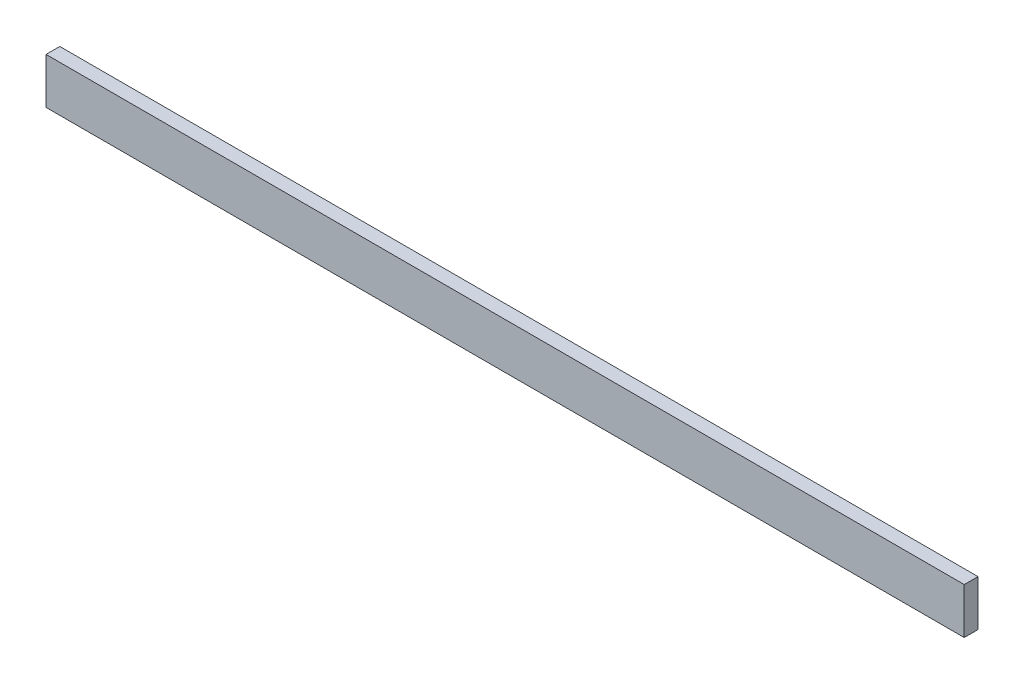
ISO-10303-21;
HEADER;
FILE_DESCRIPTION(('STEP AP214'),'2;1');
FILE_NAME('part.step','',(''),(''),'','','');
FILE_SCHEMA(('AUTOMOTIVE_DESIGN { 1 0 10303 214 1 1 1 1 }'));
ENDSEC;
DATA;
#1=APPLICATION_CONTEXT('core data for automotive mechanical design processes');
#2=APPLICATION_PROTOCOL_DEFINITION('international standard','automotive_design',2000,#1);
#3=PRODUCT_CONTEXT('',#1,'mechanical');
#4=PRODUCT('Part','Part','',(#3));
#5=PRODUCT_RELATED_PRODUCT_CATEGORY('part','',(#4));
#6=PRODUCT_DEFINITION_FORMATION('','',#4);
#7=PRODUCT_DEFINITION_CONTEXT('part definition',#1,'design');
#8=PRODUCT_DEFINITION('design','',#6,#7);
#9=PRODUCT_DEFINITION_SHAPE('','',#8);
#10=(LENGTH_UNIT() NAMED_UNIT(*) SI_UNIT(.MILLI.,.METRE.));
#11=(NAMED_UNIT(*) PLANE_ANGLE_UNIT() SI_UNIT($,.RADIAN.));
#12=(NAMED_UNIT(*) SI_UNIT($,.STERADIAN.) SOLID_ANGLE_UNIT());
#13=UNCERTAINTY_MEASURE_WITH_UNIT(LENGTH_MEASURE(1.E-05),#10,'distance_accuracy_value','');
#14=(GEOMETRIC_REPRESENTATION_CONTEXT(3) GLOBAL_UNCERTAINTY_ASSIGNED_CONTEXT((#13)) GLOBAL_UNIT_ASSIGNED_CONTEXT((#10,
#11,#12)) REPRESENTATION_CONTEXT('',''));
#15=CARTESIAN_POINT('',(0.,0.,0.));
#16=DIRECTION('',(0.,0.,1.));
#17=DIRECTION('',(1.,0.,0.));
#18=AXIS2_PLACEMENT_3D('',#15,#16,#17);
#19=CARTESIAN_POINT('',(0.,0.,3.));
#20=DIRECTION('',(1.,0.,0.));
#21=DIRECTION('',(0.,0.,-1.));
#22=AXIS2_PLACEMENT_3D('',#19,#20,#21);
#23=PLANE('',#22);
#24=DIRECTION('',(0.,-1.,0.));
#25=VECTOR('',#24,1.);
#26=CARTESIAN_POINT('',(0.,0.,0.));
#27=LINE('',#26,#25);
#28=CARTESIAN_POINT('',(0.,10.,0.));
#29=VERTEX_POINT('',#28);
#30=CARTESIAN_POINT('',(0.,0.,0.));
#31=VERTEX_POINT('',#30);
#32=EDGE_CURVE('E96',#29,#31,#27,.T.);
#33=ORIENTED_EDGE('',*,*,#32,.T.);
#34=DIRECTION('',(0.,0.,-1.));
#35=VECTOR('',#34,1.);
#36=CARTESIAN_POINT('',(0.,0.,3.));
#37=LINE('',#36,#35);
#38=CARTESIAN_POINT('',(0.,0.,3.));
#39=VERTEX_POINT('',#38);
#40=EDGE_CURVE('E11',#39,#31,#37,.T.);
#41=ORIENTED_EDGE('',*,*,#40,.F.);
#42=DIRECTION('',(0.,-1.,0.));
#43=VECTOR('',#42,1.);
#44=CARTESIAN_POINT('',(0.,0.,3.));
#45=LINE('',#44,#43);
#46=CARTESIAN_POINT('',(0.,10.,3.));
#47=VERTEX_POINT('',#46);
#48=EDGE_CURVE('E84',#47,#39,#45,.T.);
#49=ORIENTED_EDGE('',*,*,#48,.F.);
#50=DIRECTION('',(0.,0.,-1.));
#51=VECTOR('',#50,1.);
#52=CARTESIAN_POINT('',(0.,10.,3.));
#53=LINE('',#52,#51);
#54=EDGE_CURVE('E92',#47,#29,#53,.T.);
#55=ORIENTED_EDGE('',*,*,#54,.T.);
#56=EDGE_LOOP('',(#33,#41,#49,#55));
#57=FACE_BOUND('',#56,.T.);
#58=ADVANCED_FACE('F33',(#57),#23,.F.);
#59=CARTESIAN_POINT('',(0.,0.,3.));
#60=DIRECTION('',(0.,1.,0.));
#61=DIRECTION('',(0.,0.,1.));
#62=AXIS2_PLACEMENT_3D('',#59,#60,#61);
#63=PLANE('',#62);
#64=DIRECTION('',(1.,0.,0.));
#65=VECTOR('',#64,1.);
#66=CARTESIAN_POINT('',(0.,0.,0.));
#67=LINE('',#66,#65);
#68=CARTESIAN_POINT('',(200.,0.,0.));
#69=VERTEX_POINT('',#68);
#70=EDGE_CURVE('E88',#31,#69,#67,.T.);
#71=ORIENTED_EDGE('',*,*,#70,.T.);
#72=DIRECTION('',(0.,0.,-1.));
#73=VECTOR('',#72,1.);
#74=CARTESIAN_POINT('',(200.,0.,3.));
#75=LINE('',#74,#73);
#76=CARTESIAN_POINT('',(200.,0.,3.));
#77=VERTEX_POINT('',#76);
#78=EDGE_CURVE('E41',#77,#69,#75,.T.);
#79=ORIENTED_EDGE('',*,*,#78,.F.);
#80=DIRECTION('',(1.,0.,0.));
#81=VECTOR('',#80,1.);
#82=CARTESIAN_POINT('',(0.,0.,3.));
#83=LINE('',#82,#81);
#84=EDGE_CURVE('E79',#39,#77,#83,.T.);
#85=ORIENTED_EDGE('',*,*,#84,.F.);
#86=ORIENTED_EDGE('',*,*,#40,.T.);
#87=EDGE_LOOP('',(#71,#79,#85,#86));
#88=FACE_BOUND('',#87,.T.);
#89=ADVANCED_FACE('F87',(#88),#63,.F.);
#90=CARTESIAN_POINT('',(200.,0.,3.));
#91=DIRECTION('',(-1.,0.,0.));
#92=DIRECTION('',(0.,0.,1.));
#93=AXIS2_PLACEMENT_3D('',#90,#91,#92);
#94=PLANE('',#93);
#95=DIRECTION('',(0.,1.,0.));
#96=VECTOR('',#95,1.);
#97=CARTESIAN_POINT('',(200.,0.,0.));
#98=LINE('',#97,#96);
#99=CARTESIAN_POINT('',(200.,10.,0.));
#100=VERTEX_POINT('',#99);
#101=EDGE_CURVE('E66',#69,#100,#98,.T.);
#102=ORIENTED_EDGE('',*,*,#101,.T.);
#103=DIRECTION('',(0.,0.,-1.));
#104=VECTOR('',#103,1.);
#105=CARTESIAN_POINT('',(200.,10.,3.));
#106=LINE('',#105,#104);
#107=CARTESIAN_POINT('',(200.,10.,3.));
#108=VERTEX_POINT('',#107);
#109=EDGE_CURVE('E89',#108,#100,#106,.T.);
#110=ORIENTED_EDGE('',*,*,#109,.F.);
#111=DIRECTION('',(0.,1.,0.));
#112=VECTOR('',#111,1.);
#113=CARTESIAN_POINT('',(200.,0.,3.));
#114=LINE('',#113,#112);
#115=EDGE_CURVE('E82',#77,#108,#114,.T.);
#116=ORIENTED_EDGE('',*,*,#115,.F.);
#117=ORIENTED_EDGE('',*,*,#78,.T.);
#118=EDGE_LOOP('',(#102,#110,#116,#117));
#119=FACE_BOUND('',#118,.T.);
#120=ADVANCED_FACE('F90',(#119),#94,.F.);
#121=CARTESIAN_POINT('',(0.,10.,3.));
#122=DIRECTION('',(0.,-1.,0.));
#123=DIRECTION('',(0.,0.,-1.));
#124=AXIS2_PLACEMENT_3D('',#121,#122,#123);
#125=PLANE('',#124);
#126=DIRECTION('',(-1.,0.,0.));
#127=VECTOR('',#126,1.);
#128=CARTESIAN_POINT('',(0.,10.,0.));
#129=LINE('',#128,#127);
#130=EDGE_CURVE('E72',#100,#29,#129,.T.);
#131=ORIENTED_EDGE('',*,*,#130,.T.);
#132=ORIENTED_EDGE('',*,*,#54,.F.);
#133=DIRECTION('',(-1.,0.,0.));
#134=VECTOR('',#133,1.);
#135=CARTESIAN_POINT('',(0.,10.,3.));
#136=LINE('',#135,#134);
#137=EDGE_CURVE('E49',#108,#47,#136,.T.);
#138=ORIENTED_EDGE('',*,*,#137,.F.);
#139=ORIENTED_EDGE('',*,*,#109,.T.);
#140=EDGE_LOOP('',(#131,#132,#138,#139));
#141=FACE_BOUND('',#140,.T.);
#142=ADVANCED_FACE('F103',(#141),#125,.F.);
#143=CARTESIAN_POINT('',(0.,0.,3.));
#144=DIRECTION('',(0.,0.,-1.));
#145=DIRECTION('',(-1.,0.,0.));
#146=AXIS2_PLACEMENT_3D('',#143,#144,#145);
#147=PLANE('',#146);
#148=ORIENTED_EDGE('',*,*,#48,.T.);
#149=ORIENTED_EDGE('',*,*,#84,.T.);
#150=ORIENTED_EDGE('',*,*,#115,.T.);
#151=ORIENTED_EDGE('',*,*,#137,.T.);
#152=EDGE_LOOP('',(#148,#149,#150,#151));
#153=FACE_BOUND('',#152,.T.);
#154=ADVANCED_FACE('F80',(#153),#147,.F.);
#155=CARTESIAN_POINT('',(0.,0.,0.));
#156=DIRECTION('',(0.,0.,-1.));
#157=DIRECTION('',(-1.,0.,0.));
#158=AXIS2_PLACEMENT_3D('',#155,#156,#157);
#159=PLANE('',#158);
#160=ORIENTED_EDGE('',*,*,#32,.F.);
#161=ORIENTED_EDGE('',*,*,#130,.F.);
#162=ORIENTED_EDGE('',*,*,#101,.F.);
#163=ORIENTED_EDGE('',*,*,#70,.F.);
#164=EDGE_LOOP('',(#160,#161,#162,#163));
#165=FACE_BOUND('',#164,.T.);
#166=ADVANCED_FACE('F106',(#165),#159,.T.);
#167=CLOSED_SHELL('',(#58,#89,#120,#142,#154,#166));
#168=MANIFOLD_SOLID_BREP('B2',#167);
#169=ADVANCED_BREP_SHAPE_REPRESENTATION('',(#18,#168),#14);
#170=SHAPE_DEFINITION_REPRESENTATION(#9,#169);
ENDSEC;
END-ISO-10303-21;
